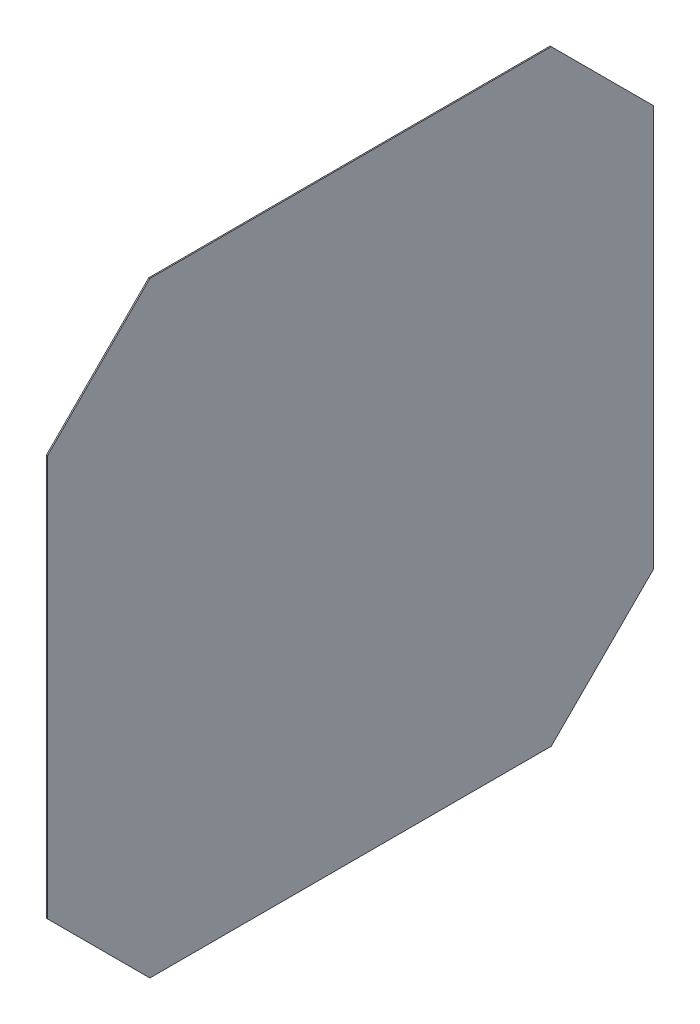
ISO-10303-21;
HEADER;
FILE_DESCRIPTION(('STEP AP214'),'2;1');
FILE_NAME('part.step','',(''),(''),'','','');
FILE_SCHEMA(('AUTOMOTIVE_DESIGN { 1 0 10303 214 1 1 1 1 }'));
ENDSEC;
DATA;
#1=APPLICATION_CONTEXT('core data for automotive mechanical design processes');
#2=APPLICATION_PROTOCOL_DEFINITION('international standard','automotive_design',2000,#1);
#3=PRODUCT_CONTEXT('',#1,'mechanical');
#4=PRODUCT('Part','Part','',(#3));
#5=PRODUCT_RELATED_PRODUCT_CATEGORY('part','',(#4));
#6=PRODUCT_DEFINITION_FORMATION('','',#4);
#7=PRODUCT_DEFINITION_CONTEXT('part definition',#1,'design');
#8=PRODUCT_DEFINITION('design','',#6,#7);
#9=PRODUCT_DEFINITION_SHAPE('','',#8);
#10=(LENGTH_UNIT() NAMED_UNIT(*) SI_UNIT(.MILLI.,.METRE.));
#11=(NAMED_UNIT(*) PLANE_ANGLE_UNIT() SI_UNIT($,.RADIAN.));
#12=(NAMED_UNIT(*) SI_UNIT($,.STERADIAN.) SOLID_ANGLE_UNIT());
#13=UNCERTAINTY_MEASURE_WITH_UNIT(LENGTH_MEASURE(1.E-05),#10,'distance_accuracy_value','');
#14=(GEOMETRIC_REPRESENTATION_CONTEXT(3) GLOBAL_UNCERTAINTY_ASSIGNED_CONTEXT((#13)) GLOBAL_UNIT_ASSIGNED_CONTEXT((#10,
#11,#12)) REPRESENTATION_CONTEXT('',''));
#15=CARTESIAN_POINT('',(0.,0.,0.));
#16=DIRECTION('',(0.,0.,1.));
#17=DIRECTION('',(1.,0.,0.));
#18=AXIS2_PLACEMENT_3D('',#15,#16,#17);
#19=CARTESIAN_POINT('',(0.,-33.2500000001414,-33.2500000001414));
#20=DIRECTION('',(0.,-0.707106781186548,-0.707106781186548));
#21=DIRECTION('',(0.,0.707106781186548,-0.707106781186548));
#22=AXIS2_PLACEMENT_3D('',#19,#20,#21);
#23=PLANE('',#22);
#24=DIRECTION('',(0.,0.707106781186548,-0.707106781186548));
#25=VECTOR('',#24,1.);
#26=CARTESIAN_POINT('',(0.,-40.,-26.5));
#27=LINE('',#26,#25);
#28=CARTESIAN_POINT('',(0.,-40.0000000000707,-26.5000000000707));
#29=VERTEX_POINT('',#28);
#30=CARTESIAN_POINT('',(0.,-26.5000000000707,-40.0000000000707));
#31=VERTEX_POINT('',#30);
#32=EDGE_CURVE('E126',#29,#31,#27,.T.);
#33=ORIENTED_EDGE('',*,*,#32,.T.);
#34=DIRECTION('',(-1.,0.,0.));
#35=VECTOR('',#34,1.);
#36=CARTESIAN_POINT('',(0.,-26.5,-40.));
#37=LINE('',#36,#35);
#38=CARTESIAN_POINT('',(0.15,-26.5000000000354,-40.0000000000354));
#39=VERTEX_POINT('',#38);
#40=EDGE_CURVE('E117',#31,#39,#37,.F.);
#41=ORIENTED_EDGE('',*,*,#40,.T.);
#42=DIRECTION('',(0.,-0.707106781186548,0.707106781186548));
#43=VECTOR('',#42,1.);
#44=CARTESIAN_POINT('',(0.15,-26.5,-40.));
#45=LINE('',#44,#43);
#46=CARTESIAN_POINT('',(0.15,-40.0000000000707,-26.5000000000707));
#47=VERTEX_POINT('',#46);
#48=EDGE_CURVE('E124',#39,#47,#45,.T.);
#49=ORIENTED_EDGE('',*,*,#48,.T.);
#50=DIRECTION('',(1.,0.,0.));
#51=VECTOR('',#50,1.);
#52=CARTESIAN_POINT('',(0.,-40.0000000001414,-26.5000000001414));
#53=LINE('',#52,#51);
#54=EDGE_CURVE('E20',#29,#47,#53,.T.);
#55=ORIENTED_EDGE('',*,*,#54,.F.);
#56=EDGE_LOOP('',(#33,#41,#49,#55));
#57=FACE_BOUND('',#56,.T.);
#58=ADVANCED_FACE('F17',(#57),#23,.T.);
#59=CARTESIAN_POINT('',(0.,0.,-40.));
#60=DIRECTION('',(0.,0.,-1.));
#61=DIRECTION('',(-1.,0.,0.));
#62=AXIS2_PLACEMENT_3D('',#59,#60,#61);
#63=PLANE('',#62);
#64=DIRECTION('',(0.,1.,0.));
#65=VECTOR('',#64,1.);
#66=CARTESIAN_POINT('',(0.,0.,-40.));
#67=LINE('',#66,#65);
#68=CARTESIAN_POINT('',(0.,26.5000000000354,-40.0000000000354));
#69=VERTEX_POINT('',#68);
#70=EDGE_CURVE('E140',#31,#69,#67,.T.);
#71=ORIENTED_EDGE('',*,*,#70,.T.);
#72=DIRECTION('',(1.,0.,0.));
#73=VECTOR('',#72,1.);
#74=CARTESIAN_POINT('',(0.,26.5000000001414,-40.0000000001414));
#75=LINE('',#74,#73);
#76=CARTESIAN_POINT('',(0.15,26.5000000000707,-40.0000000000707));
#77=VERTEX_POINT('',#76);
#78=EDGE_CURVE('E116',#69,#77,#75,.T.);
#79=ORIENTED_EDGE('',*,*,#78,.T.);
#80=DIRECTION('',(0.,1.,0.));
#81=VECTOR('',#80,1.);
#82=CARTESIAN_POINT('',(0.15,0.,-40.));
#83=LINE('',#82,#81);
#84=EDGE_CURVE('E127',#77,#39,#83,.F.);
#85=ORIENTED_EDGE('',*,*,#84,.T.);
#86=ORIENTED_EDGE('',*,*,#40,.F.);
#87=EDGE_LOOP('',(#71,#79,#85,#86));
#88=FACE_BOUND('',#87,.T.);
#89=ADVANCED_FACE('F163',(#88),#63,.T.);
#90=CARTESIAN_POINT('',(0.,33.2500000001414,-33.2500000001414));
#91=DIRECTION('',(0.,0.707106781186548,-0.707106781186548));
#92=DIRECTION('',(0.,0.707106781186548,0.707106781186548));
#93=AXIS2_PLACEMENT_3D('',#90,#91,#92);
#94=PLANE('',#93);
#95=DIRECTION('',(0.,0.707106781186548,0.707106781186548));
#96=VECTOR('',#95,1.);
#97=CARTESIAN_POINT('',(0.,26.5,-40.));
#98=LINE('',#97,#96);
#99=CARTESIAN_POINT('',(0.,40.0000000000707,-26.5000000000707));
#100=VERTEX_POINT('',#99);
#101=EDGE_CURVE('E138',#69,#100,#98,.T.);
#102=ORIENTED_EDGE('',*,*,#101,.T.);
#103=DIRECTION('',(1.,0.,0.));
#104=VECTOR('',#103,1.);
#105=CARTESIAN_POINT('',(0.,40.,-26.5));
#106=LINE('',#105,#104);
#107=CARTESIAN_POINT('',(0.15,40.0000000000354,-26.5000000000354));
#108=VERTEX_POINT('',#107);
#109=EDGE_CURVE('E114',#100,#108,#106,.T.);
#110=ORIENTED_EDGE('',*,*,#109,.T.);
#111=DIRECTION('',(0.,-0.707106781186548,-0.707106781186548));
#112=VECTOR('',#111,1.);
#113=CARTESIAN_POINT('',(0.15,40.,-26.5));
#114=LINE('',#113,#112);
#115=EDGE_CURVE('E144',#108,#77,#114,.T.);
#116=ORIENTED_EDGE('',*,*,#115,.T.);
#117=ORIENTED_EDGE('',*,*,#78,.F.);
#118=EDGE_LOOP('',(#102,#110,#116,#117));
#119=FACE_BOUND('',#118,.T.);
#120=ADVANCED_FACE('F155',(#119),#94,.T.);
#121=CARTESIAN_POINT('',(0.,40.,0.));
#122=DIRECTION('',(0.,1.,0.));
#123=DIRECTION('',(0.,0.,1.));
#124=AXIS2_PLACEMENT_3D('',#121,#122,#123);
#125=PLANE('',#124);
#126=DIRECTION('',(0.,0.,-1.));
#127=VECTOR('',#126,1.);
#128=CARTESIAN_POINT('',(0.,40.,0.));
#129=LINE('',#128,#127);
#130=CARTESIAN_POINT('',(0.,40.0000000000354,26.5000000000354));
#131=VERTEX_POINT('',#130);
#132=EDGE_CURVE('E136',#100,#131,#129,.F.);
#133=ORIENTED_EDGE('',*,*,#132,.T.);
#134=DIRECTION('',(1.,0.,0.));
#135=VECTOR('',#134,1.);
#136=CARTESIAN_POINT('',(0.,40.0000000001414,26.5000000001414));
#137=LINE('',#136,#135);
#138=CARTESIAN_POINT('',(0.15,40.0000000000707,26.5000000000707));
#139=VERTEX_POINT('',#138);
#140=EDGE_CURVE('E112',#131,#139,#137,.T.);
#141=ORIENTED_EDGE('',*,*,#140,.T.);
#142=DIRECTION('',(0.,0.,-1.));
#143=VECTOR('',#142,1.);
#144=CARTESIAN_POINT('',(0.15,40.,0.));
#145=LINE('',#144,#143);
#146=EDGE_CURVE('E106',#139,#108,#145,.T.);
#147=ORIENTED_EDGE('',*,*,#146,.T.);
#148=ORIENTED_EDGE('',*,*,#109,.F.);
#149=EDGE_LOOP('',(#133,#141,#147,#148));
#150=FACE_BOUND('',#149,.T.);
#151=ADVANCED_FACE('F150',(#150),#125,.T.);
#152=CARTESIAN_POINT('',(0.,33.2500000001414,33.2500000001414));
#153=DIRECTION('',(0.,0.707106781186548,0.707106781186548));
#154=DIRECTION('',(0.,-0.707106781186548,0.707106781186548));
#155=AXIS2_PLACEMENT_3D('',#152,#153,#154);
#156=PLANE('',#155);
#157=DIRECTION('',(0.,-0.707106781186548,0.707106781186548));
#158=VECTOR('',#157,1.);
#159=CARTESIAN_POINT('',(0.,40.,26.5));
#160=LINE('',#159,#158);
#161=CARTESIAN_POINT('',(0.,26.5000000000707,40.0000000000707));
#162=VERTEX_POINT('',#161);
#163=EDGE_CURVE('E134',#131,#162,#160,.T.);
#164=ORIENTED_EDGE('',*,*,#163,.T.);
#165=DIRECTION('',(1.,0.,0.));
#166=VECTOR('',#165,1.);
#167=CARTESIAN_POINT('',(0.,26.5,40.));
#168=LINE('',#167,#166);
#169=CARTESIAN_POINT('',(0.15,26.5000000000354,40.0000000000354));
#170=VERTEX_POINT('',#169);
#171=EDGE_CURVE('E79',#162,#170,#168,.T.);
#172=ORIENTED_EDGE('',*,*,#171,.T.);
#173=DIRECTION('',(0.,0.707106781186548,-0.707106781186548));
#174=VECTOR('',#173,1.);
#175=CARTESIAN_POINT('',(0.15,26.5,40.));
#176=LINE('',#175,#174);
#177=EDGE_CURVE('E104',#170,#139,#176,.T.);
#178=ORIENTED_EDGE('',*,*,#177,.T.);
#179=ORIENTED_EDGE('',*,*,#140,.F.);
#180=EDGE_LOOP('',(#164,#172,#178,#179));
#181=FACE_BOUND('',#180,.T.);
#182=ADVANCED_FACE('F161',(#181),#156,.T.);
#183=CARTESIAN_POINT('',(0.,0.,40.));
#184=DIRECTION('',(0.,0.,1.));
#185=DIRECTION('',(1.,0.,0.));
#186=AXIS2_PLACEMENT_3D('',#183,#184,#185);
#187=PLANE('',#186);
#188=DIRECTION('',(0.,1.,0.));
#189=VECTOR('',#188,1.);
#190=CARTESIAN_POINT('',(0.,0.,40.));
#191=LINE('',#190,#189);
#192=CARTESIAN_POINT('',(0.,-26.5000000000354,40.0000000000354));
#193=VERTEX_POINT('',#192);
#194=EDGE_CURVE('E91',#162,#193,#191,.F.);
#195=ORIENTED_EDGE('',*,*,#194,.T.);
#196=DIRECTION('',(1.,0.,0.));
#197=VECTOR('',#196,1.);
#198=CARTESIAN_POINT('',(0.,-26.5000000001414,40.0000000001414));
#199=LINE('',#198,#197);
#200=CARTESIAN_POINT('',(0.15,-26.5000000000707,40.0000000000707));
#201=VERTEX_POINT('',#200);
#202=EDGE_CURVE('E84',#193,#201,#199,.T.);
#203=ORIENTED_EDGE('',*,*,#202,.T.);
#204=DIRECTION('',(0.,1.,0.));
#205=VECTOR('',#204,1.);
#206=CARTESIAN_POINT('',(0.15,0.,40.));
#207=LINE('',#206,#205);
#208=EDGE_CURVE('E88',#201,#170,#207,.T.);
#209=ORIENTED_EDGE('',*,*,#208,.T.);
#210=ORIENTED_EDGE('',*,*,#171,.F.);
#211=EDGE_LOOP('',(#195,#203,#209,#210));
#212=FACE_BOUND('',#211,.T.);
#213=ADVANCED_FACE('F86',(#212),#187,.T.);
#214=CARTESIAN_POINT('',(0.,-33.2500000001414,33.2500000001414));
#215=DIRECTION('',(0.,-0.707106781186548,0.707106781186548));
#216=DIRECTION('',(0.,-0.707106781186548,-0.707106781186548));
#217=AXIS2_PLACEMENT_3D('',#214,#215,#216);
#218=PLANE('',#217);
#219=DIRECTION('',(0.,-0.707106781186548,-0.707106781186548));
#220=VECTOR('',#219,1.);
#221=CARTESIAN_POINT('',(0.,-26.5,40.));
#222=LINE('',#221,#220);
#223=CARTESIAN_POINT('',(0.,-40.0000000000707,26.5000000000707));
#224=VERTEX_POINT('',#223);
#225=EDGE_CURVE('E129',#193,#224,#222,.T.);
#226=ORIENTED_EDGE('',*,*,#225,.T.);
#227=DIRECTION('',(1.,0.,0.));
#228=VECTOR('',#227,1.);
#229=CARTESIAN_POINT('',(0.,-40.0000000001414,26.5000000001414));
#230=LINE('',#229,#228);
#231=CARTESIAN_POINT('',(0.15,-40.0000000000707,26.5000000000707));
#232=VERTEX_POINT('',#231);
#233=EDGE_CURVE('E35',#232,#224,#230,.F.);
#234=ORIENTED_EDGE('',*,*,#233,.F.);
#235=DIRECTION('',(0.,0.707106781186548,0.707106781186548));
#236=VECTOR('',#235,1.);
#237=CARTESIAN_POINT('',(0.15,-40.,26.5));
#238=LINE('',#237,#236);
#239=EDGE_CURVE('E94',#232,#201,#238,.T.);
#240=ORIENTED_EDGE('',*,*,#239,.T.);
#241=ORIENTED_EDGE('',*,*,#202,.F.);
#242=EDGE_LOOP('',(#226,#234,#240,#241));
#243=FACE_BOUND('',#242,.T.);
#244=ADVANCED_FACE('F97',(#243),#218,.T.);
#245=CARTESIAN_POINT('',(0.15,0.,0.));
#246=DIRECTION('',(1.,0.,0.));
#247=DIRECTION('',(0.,0.,-1.));
#248=AXIS2_PLACEMENT_3D('',#245,#246,#247);
#249=PLANE('',#248);
#250=ORIENTED_EDGE('',*,*,#48,.F.);
#251=ORIENTED_EDGE('',*,*,#84,.F.);
#252=ORIENTED_EDGE('',*,*,#115,.F.);
#253=ORIENTED_EDGE('',*,*,#146,.F.);
#254=ORIENTED_EDGE('',*,*,#177,.F.);
#255=ORIENTED_EDGE('',*,*,#208,.F.);
#256=ORIENTED_EDGE('',*,*,#239,.F.);
#257=DIRECTION('',(0.,0.,-1.));
#258=VECTOR('',#257,1.);
#259=CARTESIAN_POINT('',(0.15,-40.,0.));
#260=LINE('',#259,#258);
#261=EDGE_CURVE('E26',#232,#47,#260,.T.);
#262=ORIENTED_EDGE('',*,*,#261,.T.);
#263=EDGE_LOOP('',(#250,#251,#252,#253,#254,#255,#256,#262));
#264=FACE_BOUND('',#263,.T.);
#265=ADVANCED_FACE('F102',(#264),#249,.T.);
#266=CARTESIAN_POINT('',(0.,0.,0.));
#267=DIRECTION('',(1.,0.,0.));
#268=DIRECTION('',(0.,0.,-1.));
#269=AXIS2_PLACEMENT_3D('',#266,#267,#268);
#270=PLANE('',#269);
#271=ORIENTED_EDGE('',*,*,#194,.F.);
#272=ORIENTED_EDGE('',*,*,#163,.F.);
#273=ORIENTED_EDGE('',*,*,#132,.F.);
#274=ORIENTED_EDGE('',*,*,#101,.F.);
#275=ORIENTED_EDGE('',*,*,#70,.F.);
#276=ORIENTED_EDGE('',*,*,#32,.F.);
#277=DIRECTION('',(0.,0.,-1.));
#278=VECTOR('',#277,1.);
#279=CARTESIAN_POINT('',(0.,-40.,0.));
#280=LINE('',#279,#278);
#281=EDGE_CURVE('E11',#29,#224,#280,.F.);
#282=ORIENTED_EDGE('',*,*,#281,.T.);
#283=ORIENTED_EDGE('',*,*,#225,.F.);
#284=EDGE_LOOP('',(#271,#272,#273,#274,#275,#276,#282,#283));
#285=FACE_BOUND('',#284,.T.);
#286=ADVANCED_FACE('F159',(#285),#270,.F.);
#287=CARTESIAN_POINT('',(0.,-40.,0.));
#288=DIRECTION('',(0.,-1.,0.));
#289=DIRECTION('',(0.,0.,-1.));
#290=AXIS2_PLACEMENT_3D('',#287,#288,#289);
#291=PLANE('',#290);
#292=ORIENTED_EDGE('',*,*,#281,.F.);
#293=ORIENTED_EDGE('',*,*,#54,.T.);
#294=ORIENTED_EDGE('',*,*,#261,.F.);
#295=ORIENTED_EDGE('',*,*,#233,.T.);
#296=EDGE_LOOP('',(#292,#293,#294,#295));
#297=FACE_BOUND('',#296,.T.);
#298=ADVANCED_FACE('F122',(#297),#291,.T.);
#299=CLOSED_SHELL('',(#58,#89,#120,#151,#182,#213,#244,#265,#286,#298));
#300=MANIFOLD_SOLID_BREP('B1',#299);
#301=ADVANCED_BREP_SHAPE_REPRESENTATION('',(#18,#300),#14);
#302=SHAPE_DEFINITION_REPRESENTATION(#9,#301);
ENDSEC;
END-ISO-10303-21;
